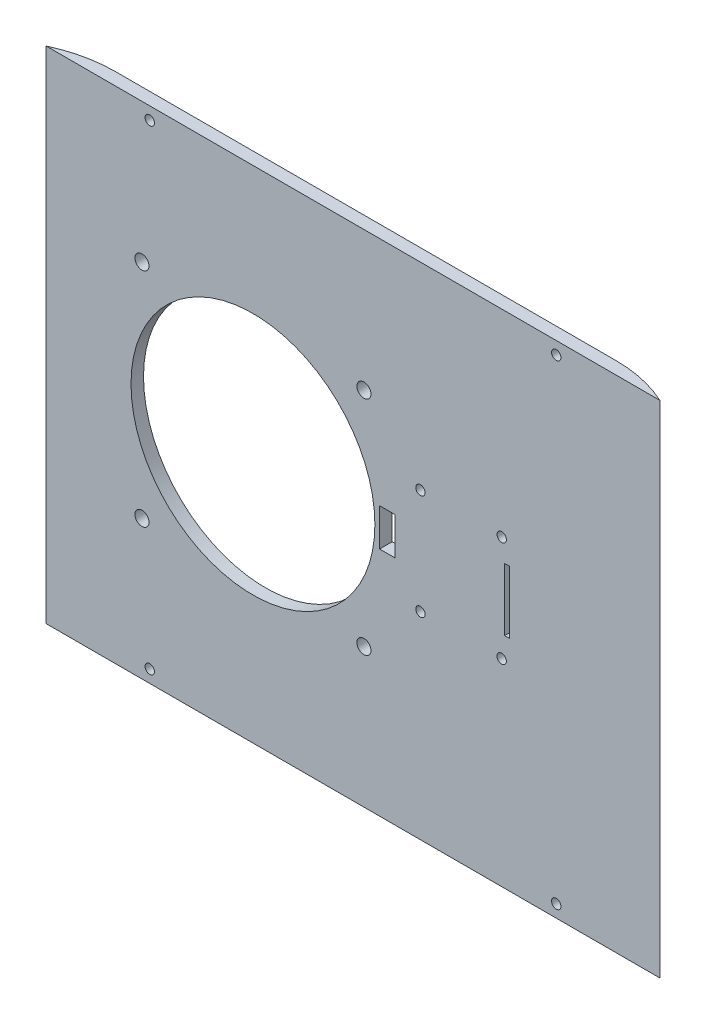
ISO-10303-21;
HEADER;
FILE_DESCRIPTION(('STEP AP214'),'2;1');
FILE_NAME('part.step','',(''),(''),'','','');
FILE_SCHEMA(('AUTOMOTIVE_DESIGN { 1 0 10303 214 1 1 1 1 }'));
ENDSEC;
DATA;
#1=APPLICATION_CONTEXT('core data for automotive mechanical design processes');
#2=APPLICATION_PROTOCOL_DEFINITION('international standard','automotive_design',2000,#1);
#3=PRODUCT_CONTEXT('',#1,'mechanical');
#4=PRODUCT('Part','Part','',(#3));
#5=PRODUCT_RELATED_PRODUCT_CATEGORY('part','',(#4));
#6=PRODUCT_DEFINITION_FORMATION('','',#4);
#7=PRODUCT_DEFINITION_CONTEXT('part definition',#1,'design');
#8=PRODUCT_DEFINITION('design','',#6,#7);
#9=PRODUCT_DEFINITION_SHAPE('','',#8);
#10=(LENGTH_UNIT() NAMED_UNIT(*) SI_UNIT(.MILLI.,.METRE.));
#11=(NAMED_UNIT(*) PLANE_ANGLE_UNIT() SI_UNIT($,.RADIAN.));
#12=(NAMED_UNIT(*) SI_UNIT($,.STERADIAN.) SOLID_ANGLE_UNIT());
#13=UNCERTAINTY_MEASURE_WITH_UNIT(LENGTH_MEASURE(1.E-05),#10,'distance_accuracy_value','');
#14=(GEOMETRIC_REPRESENTATION_CONTEXT(3) GLOBAL_UNCERTAINTY_ASSIGNED_CONTEXT((#13)) GLOBAL_UNIT_ASSIGNED_CONTEXT((#10,
#11,#12)) REPRESENTATION_CONTEXT('',''));
#15=CARTESIAN_POINT('',(0.,0.,0.));
#16=DIRECTION('',(0.,0.,1.));
#17=DIRECTION('',(1.,0.,0.));
#18=AXIS2_PLACEMENT_3D('',#15,#16,#17);
#19=CARTESIAN_POINT('',(0.,0.,0.));
#20=DIRECTION('',(0.,0.,1.));
#21=DIRECTION('',(1.,0.,0.));
#22=AXIS2_PLACEMENT_3D('',#19,#20,#21);
#23=PLANE('',#22);
#24=CARTESIAN_POINT('',(61.5161251372119,-62.99,0.));
#25=DIRECTION('',(0.,0.,1.));
#26=DIRECTION('',(1.,0.,0.));
#27=AXIS2_PLACEMENT_3D('',#24,#25,#26);
#28=CIRCLE('',#27,1.49999999999999);
#29=CARTESIAN_POINT('',(63.0161251372118,-62.99,0.));
#30=VERTEX_POINT('',#29);
#31=EDGE_CURVE('E317',#30,#30,#28,.T.);
#32=ORIENTED_EDGE('',*,*,#31,.T.);
#33=EDGE_LOOP('',(#32));
#34=FACE_BOUND('',#33,.T.);
#35=CARTESIAN_POINT('',(-68.4838748627881,-62.99,0.));
#36=DIRECTION('',(0.,0.,1.));
#37=DIRECTION('',(1.,0.,0.));
#38=AXIS2_PLACEMENT_3D('',#35,#36,#37);
#39=CIRCLE('',#38,1.5);
#40=CARTESIAN_POINT('',(-66.9838748627881,-62.99,0.));
#41=VERTEX_POINT('',#40);
#42=EDGE_CURVE('E322',#41,#41,#39,.T.);
#43=ORIENTED_EDGE('',*,*,#42,.T.);
#44=EDGE_LOOP('',(#43));
#45=FACE_BOUND('',#44,.T.);
#46=CARTESIAN_POINT('',(61.5161251372119,89.01,0.));
#47=DIRECTION('',(0.,0.,1.));
#48=DIRECTION('',(1.,0.,0.));
#49=AXIS2_PLACEMENT_3D('',#46,#47,#48);
#50=CIRCLE('',#49,1.49999999999999);
#51=CARTESIAN_POINT('',(63.0161251372118,89.01,0.));
#52=VERTEX_POINT('',#51);
#53=EDGE_CURVE('E330',#52,#52,#50,.T.);
#54=ORIENTED_EDGE('',*,*,#53,.T.);
#55=EDGE_LOOP('',(#54));
#56=FACE_BOUND('',#55,.T.);
#57=CARTESIAN_POINT('',(-68.4838748627882,89.01,0.));
#58=DIRECTION('',(0.,0.,1.));
#59=DIRECTION('',(1.,0.,0.));
#60=AXIS2_PLACEMENT_3D('',#57,#58,#59);
#61=CIRCLE('',#60,1.5);
#62=CARTESIAN_POINT('',(-66.9838748627882,89.01,0.));
#63=VERTEX_POINT('',#62);
#64=EDGE_CURVE('E338',#63,#63,#61,.T.);
#65=ORIENTED_EDGE('',*,*,#64,.T.);
#66=EDGE_LOOP('',(#65));
#67=FACE_BOUND('',#66,.T.);
#68=CARTESIAN_POINT('',(44.0719050477542,29.8436474999944,0.));
#69=DIRECTION('',(0.,0.,-1.));
#70=DIRECTION('',(-1.,0.,0.));
#71=AXIS2_PLACEMENT_3D('',#68,#69,#70);
#72=CIRCLE('',#71,1.5);
#73=CARTESIAN_POINT('',(42.5719050477542,29.8436474999944,0.));
#74=VERTEX_POINT('',#73);
#75=EDGE_CURVE('E249',#74,#74,#72,.T.);
#76=ORIENTED_EDGE('',*,*,#75,.F.);
#77=EDGE_LOOP('',(#76));
#78=FACE_BOUND('',#77,.T.);
#79=CARTESIAN_POINT('',(44.0719050477542,-3.82364749999439,0.));
#80=DIRECTION('',(0.,0.,-1.));
#81=DIRECTION('',(-1.,0.,0.));
#82=AXIS2_PLACEMENT_3D('',#79,#80,#81);
#83=CIRCLE('',#82,1.5);
#84=CARTESIAN_POINT('',(42.5719050477542,-3.82364749999439,0.));
#85=VERTEX_POINT('',#84);
#86=EDGE_CURVE('E245',#85,#85,#83,.T.);
#87=ORIENTED_EDGE('',*,*,#86,.F.);
#88=EDGE_LOOP('',(#87));
#89=FACE_BOUND('',#88,.T.);
#90=CARTESIAN_POINT('',(18.0829228366695,-3.82364749999439,0.));
#91=DIRECTION('',(0.,0.,-1.));
#92=DIRECTION('',(-1.,0.,0.));
#93=AXIS2_PLACEMENT_3D('',#90,#91,#92);
#94=CIRCLE('',#93,1.5);
#95=CARTESIAN_POINT('',(16.5829228366695,-3.82364749999439,0.));
#96=VERTEX_POINT('',#95);
#97=EDGE_CURVE('E250',#96,#96,#94,.T.);
#98=ORIENTED_EDGE('',*,*,#97,.F.);
#99=EDGE_LOOP('',(#98));
#100=FACE_BOUND('',#99,.T.);
#101=CARTESIAN_POINT('',(18.0829228366695,29.8436474999944,0.));
#102=DIRECTION('',(0.,0.,-1.));
#103=DIRECTION('',(-1.,0.,0.));
#104=AXIS2_PLACEMENT_3D('',#101,#102,#103);
#105=CIRCLE('',#104,1.5);
#106=CARTESIAN_POINT('',(16.5829228366695,29.8436474999944,0.));
#107=VERTEX_POINT('',#106);
#108=EDGE_CURVE('E254',#107,#107,#105,.T.);
#109=ORIENTED_EDGE('',*,*,#108,.F.);
#110=EDGE_LOOP('',(#109));
#111=FACE_BOUND('',#110,.T.);
#112=DIRECTION('',(-1.,0.,0.));
#113=VECTOR('',#112,1.);
#114=CARTESIAN_POINT('',(45.0161251372118,3.01000000000001,0.));
#115=LINE('',#114,#113);
#116=CARTESIAN_POINT('',(46.5161251372118,3.01000000000001,0.));
#117=VERTEX_POINT('',#116);
#118=CARTESIAN_POINT('',(45.0161251372118,3.01000000000001,0.));
#119=VERTEX_POINT('',#118);
#120=EDGE_CURVE('E261',#117,#119,#115,.T.);
#121=ORIENTED_EDGE('',*,*,#120,.F.);
#122=DIRECTION('',(0.,-1.,0.));
#123=VECTOR('',#122,1.);
#124=CARTESIAN_POINT('',(46.5161251372118,3.01000000000001,0.));
#125=LINE('',#124,#123);
#126=CARTESIAN_POINT('',(46.5161251372118,23.01,0.));
#127=VERTEX_POINT('',#126);
#128=EDGE_CURVE('E244',#127,#117,#125,.T.);
#129=ORIENTED_EDGE('',*,*,#128,.F.);
#130=DIRECTION('',(1.,0.,0.));
#131=VECTOR('',#130,1.);
#132=CARTESIAN_POINT('',(46.5161251372118,23.01,0.));
#133=LINE('',#132,#131);
#134=CARTESIAN_POINT('',(45.0161251372118,23.01,0.));
#135=VERTEX_POINT('',#134);
#136=EDGE_CURVE('E269',#135,#127,#133,.T.);
#137=ORIENTED_EDGE('',*,*,#136,.F.);
#138=DIRECTION('',(0.,1.,0.));
#139=VECTOR('',#138,1.);
#140=CARTESIAN_POINT('',(45.0161251372118,23.01,0.));
#141=LINE('',#140,#139);
#142=EDGE_CURVE('E265',#119,#135,#141,.T.);
#143=ORIENTED_EDGE('',*,*,#142,.F.);
#144=EDGE_LOOP('',(#121,#129,#137,#143));
#145=FACE_BOUND('',#144,.T.);
#146=CARTESIAN_POINT('',(-35.4838748627881,13.01,0.));
#147=DIRECTION('',(0.,0.,-1.));
#148=DIRECTION('',(-1.,0.,0.));
#149=AXIS2_PLACEMENT_3D('',#146,#147,#148);
#150=CIRCLE('',#149,39.);
#151=CARTESIAN_POINT('',(-74.4838748627882,13.01,0.));
#152=VERTEX_POINT('',#151);
#153=EDGE_CURVE('E172',#152,#152,#150,.T.);
#154=ORIENTED_EDGE('',*,*,#153,.F.);
#155=EDGE_LOOP('',(#154));
#156=FACE_BOUND('',#155,.T.);
#157=CARTESIAN_POINT('',(-70.9838748597865,48.5099999969985,0.));
#158=DIRECTION('',(0.,0.,-1.));
#159=DIRECTION('',(-1.,0.,0.));
#160=AXIS2_PLACEMENT_3D('',#157,#158,#159);
#161=CIRCLE('',#160,2.24999999999997);
#162=CARTESIAN_POINT('',(-73.2338748597865,48.5099999969985,0.));
#163=VERTEX_POINT('',#162);
#164=EDGE_CURVE('E168',#163,#163,#161,.T.);
#165=ORIENTED_EDGE('',*,*,#164,.F.);
#166=EDGE_LOOP('',(#165));
#167=FACE_BOUND('',#166,.T.);
#168=CARTESIAN_POINT('',(-70.9838748597865,-22.4899999969985,0.));
#169=DIRECTION('',(0.,0.,-1.));
#170=DIRECTION('',(1.,0.,0.));
#171=AXIS2_PLACEMENT_3D('',#168,#169,#170);
#172=CIRCLE('',#171,2.25000000000001);
#173=CARTESIAN_POINT('',(-68.7338748597865,-22.4899999969985,0.));
#174=VERTEX_POINT('',#173);
#175=EDGE_CURVE('E173',#174,#174,#172,.T.);
#176=ORIENTED_EDGE('',*,*,#175,.F.);
#177=EDGE_LOOP('',(#176));
#178=FACE_BOUND('',#177,.T.);
#179=CARTESIAN_POINT('',(0.0161251342101765,48.5099999969985,0.));
#180=DIRECTION('',(0.,0.,-1.));
#181=DIRECTION('',(1.,0.,0.));
#182=AXIS2_PLACEMENT_3D('',#179,#180,#181);
#183=CIRCLE('',#182,2.25);
#184=CARTESIAN_POINT('',(2.26612513421017,48.5099999969985,0.));
#185=VERTEX_POINT('',#184);
#186=EDGE_CURVE('E177',#185,#185,#183,.T.);
#187=ORIENTED_EDGE('',*,*,#186,.F.);
#188=EDGE_LOOP('',(#187));
#189=FACE_BOUND('',#188,.T.);
#190=CARTESIAN_POINT('',(0.0161251342101765,-22.4899999969985,0.));
#191=DIRECTION('',(0.,0.,-1.));
#192=DIRECTION('',(-1.,0.,0.));
#193=AXIS2_PLACEMENT_3D('',#190,#191,#192);
#194=CIRCLE('',#193,2.25000000000001);
#195=CARTESIAN_POINT('',(-2.23387486578983,-22.4899999969985,0.));
#196=VERTEX_POINT('',#195);
#197=EDGE_CURVE('E181',#196,#196,#194,.T.);
#198=ORIENTED_EDGE('',*,*,#197,.F.);
#199=EDGE_LOOP('',(#198));
#200=FACE_BOUND('',#199,.T.);
#201=DIRECTION('',(-1.,0.,0.));
#202=VECTOR('',#201,1.);
#203=CARTESIAN_POINT('',(5.01612513721185,7.01,0.));
#204=LINE('',#203,#202);
#205=CARTESIAN_POINT('',(10.0161251372119,7.01,0.));
#206=VERTEX_POINT('',#205);
#207=CARTESIAN_POINT('',(5.01612513721185,7.01,0.));
#208=VERTEX_POINT('',#207);
#209=EDGE_CURVE('E188',#206,#208,#204,.T.);
#210=ORIENTED_EDGE('',*,*,#209,.F.);
#211=DIRECTION('',(0.,-1.,0.));
#212=VECTOR('',#211,1.);
#213=CARTESIAN_POINT('',(10.0161251372119,7.01,0.));
#214=LINE('',#213,#212);
#215=CARTESIAN_POINT('',(10.0161251372119,19.01,0.));
#216=VERTEX_POINT('',#215);
#217=EDGE_CURVE('E67',#216,#206,#214,.T.);
#218=ORIENTED_EDGE('',*,*,#217,.F.);
#219=DIRECTION('',(1.,0.,0.));
#220=VECTOR('',#219,1.);
#221=CARTESIAN_POINT('',(5.01612513721185,19.01,0.));
#222=LINE('',#221,#220);
#223=CARTESIAN_POINT('',(5.01612513721185,19.01,0.));
#224=VERTEX_POINT('',#223);
#225=EDGE_CURVE('E195',#224,#216,#222,.T.);
#226=ORIENTED_EDGE('',*,*,#225,.F.);
#227=DIRECTION('',(0.,1.,0.));
#228=VECTOR('',#227,1.);
#229=CARTESIAN_POINT('',(5.01612513721185,7.01,0.));
#230=LINE('',#229,#228);
#231=EDGE_CURVE('E191',#208,#224,#230,.T.);
#232=ORIENTED_EDGE('',*,*,#231,.F.);
#233=EDGE_LOOP('',(#210,#218,#226,#232));
#234=FACE_BOUND('',#233,.T.);
#235=DIRECTION('',(0.,1.,0.));
#236=VECTOR('',#235,1.);
#237=CARTESIAN_POINT('',(-83.4838748627882,-136.12835714,0.));
#238=LINE('',#237,#236);
#239=CARTESIAN_POINT('',(-83.4838748627882,-66.99,0.));
#240=VERTEX_POINT('',#239);
#241=CARTESIAN_POINT('',(-83.4838748627882,93.01,0.));
#242=VERTEX_POINT('',#241);
#243=EDGE_CURVE('E154',#240,#242,#238,.T.);
#244=ORIENTED_EDGE('',*,*,#243,.T.);
#245=DIRECTION('',(-1.,0.,0.));
#246=VECTOR('',#245,1.);
#247=CARTESIAN_POINT('',(-83.4838748627882,93.01,0.));
#248=LINE('',#247,#246);
#249=CARTESIAN_POINT('',(76.5161251372118,93.01,0.));
#250=VERTEX_POINT('',#249);
#251=EDGE_CURVE('E45',#250,#242,#248,.T.);
#252=ORIENTED_EDGE('',*,*,#251,.F.);
#253=DIRECTION('',(0.,1.,0.));
#254=VECTOR('',#253,1.);
#255=CARTESIAN_POINT('',(76.5161251372118,-136.12835714,0.));
#256=LINE('',#255,#254);
#257=CARTESIAN_POINT('',(76.5161251372118,-66.99,0.));
#258=VERTEX_POINT('',#257);
#259=EDGE_CURVE('E155',#258,#250,#256,.T.);
#260=ORIENTED_EDGE('',*,*,#259,.F.);
#261=DIRECTION('',(1.,0.,0.));
#262=VECTOR('',#261,1.);
#263=CARTESIAN_POINT('',(-83.4838748627881,-66.99,0.));
#264=LINE('',#263,#262);
#265=EDGE_CURVE('E346',#240,#258,#264,.T.);
#266=ORIENTED_EDGE('',*,*,#265,.F.);
#267=EDGE_LOOP('',(#244,#252,#260,#266));
#268=FACE_BOUND('',#267,.T.);
#269=ADVANCED_FACE('F41',(#34,#45,#56,#67,#78,#89,#100,#111,#145,#156,#167,#178,#189,#200,#234,
#268),#23,.F.);
#270=CARTESIAN_POINT('',(0.,0.,4.));
#271=DIRECTION('',(0.,0.,1.));
#272=DIRECTION('',(1.,0.,0.));
#273=AXIS2_PLACEMENT_3D('',#270,#271,#272);
#274=PLANE('',#273);
#275=DIRECTION('',(0.,1.,0.));
#276=VECTOR('',#275,1.);
#277=CARTESIAN_POINT('',(10.0161251372119,0.,4.));
#278=LINE('',#277,#276);
#279=CARTESIAN_POINT('',(10.0161251372119,7.01,4.));
#280=VERTEX_POINT('',#279);
#281=CARTESIAN_POINT('',(10.0161251372119,19.01,4.));
#282=VERTEX_POINT('',#281);
#283=EDGE_CURVE('E241',#280,#282,#278,.T.);
#284=ORIENTED_EDGE('',*,*,#283,.F.);
#285=DIRECTION('',(1.,0.,0.));
#286=VECTOR('',#285,1.);
#287=CARTESIAN_POINT('',(0.,7.01,4.));
#288=LINE('',#287,#286);
#289=CARTESIAN_POINT('',(5.01612513721185,7.01,4.));
#290=VERTEX_POINT('',#289);
#291=EDGE_CURVE('E232',#290,#280,#288,.T.);
#292=ORIENTED_EDGE('',*,*,#291,.F.);
#293=DIRECTION('',(0.,-1.,0.));
#294=VECTOR('',#293,1.);
#295=CARTESIAN_POINT('',(5.01612513721185,0.,4.));
#296=LINE('',#295,#294);
#297=CARTESIAN_POINT('',(5.01612513721185,19.01,4.));
#298=VERTEX_POINT('',#297);
#299=EDGE_CURVE('E235',#298,#290,#296,.T.);
#300=ORIENTED_EDGE('',*,*,#299,.F.);
#301=DIRECTION('',(-1.,0.,0.));
#302=VECTOR('',#301,1.);
#303=CARTESIAN_POINT('',(0.,19.01,4.));
#304=LINE('',#303,#302);
#305=EDGE_CURVE('E238',#282,#298,#304,.T.);
#306=ORIENTED_EDGE('',*,*,#305,.F.);
#307=EDGE_LOOP('',(#284,#292,#300,#306));
#308=FACE_BOUND('',#307,.T.);
#309=CARTESIAN_POINT('',(0.0161251342101765,-22.4899999969985,4.));
#310=DIRECTION('',(0.,0.,1.));
#311=DIRECTION('',(1.,0.,0.));
#312=AXIS2_PLACEMENT_3D('',#309,#310,#311);
#313=CIRCLE('',#312,2.25000000000001);
#314=CARTESIAN_POINT('',(2.26612513421019,-22.4899999969985,4.));
#315=VERTEX_POINT('',#314);
#316=EDGE_CURVE('E228',#315,#315,#313,.T.);
#317=ORIENTED_EDGE('',*,*,#316,.F.);
#318=EDGE_LOOP('',(#317));
#319=FACE_BOUND('',#318,.T.);
#320=CARTESIAN_POINT('',(0.0161251342101765,48.5099999969985,4.));
#321=DIRECTION('',(0.,0.,1.));
#322=DIRECTION('',(1.,0.,0.));
#323=AXIS2_PLACEMENT_3D('',#320,#321,#322);
#324=CIRCLE('',#323,2.25);
#325=CARTESIAN_POINT('',(2.26612513421017,48.5099999969985,4.));
#326=VERTEX_POINT('',#325);
#327=EDGE_CURVE('E224',#326,#326,#324,.T.);
#328=ORIENTED_EDGE('',*,*,#327,.F.);
#329=EDGE_LOOP('',(#328));
#330=FACE_BOUND('',#329,.T.);
#331=CARTESIAN_POINT('',(-70.9838748597865,-22.4899999969985,4.));
#332=DIRECTION('',(0.,0.,1.));
#333=DIRECTION('',(1.,0.,0.));
#334=AXIS2_PLACEMENT_3D('',#331,#332,#333);
#335=CIRCLE('',#334,2.25000000000001);
#336=CARTESIAN_POINT('',(-68.7338748597865,-22.4899999969985,4.));
#337=VERTEX_POINT('',#336);
#338=EDGE_CURVE('E220',#337,#337,#335,.T.);
#339=ORIENTED_EDGE('',*,*,#338,.F.);
#340=EDGE_LOOP('',(#339));
#341=FACE_BOUND('',#340,.T.);
#342=CARTESIAN_POINT('',(-70.9838748597865,48.5099999969985,4.));
#343=DIRECTION('',(0.,0.,1.));
#344=DIRECTION('',(1.,0.,0.));
#345=AXIS2_PLACEMENT_3D('',#342,#343,#344);
#346=CIRCLE('',#345,2.24999999999997);
#347=CARTESIAN_POINT('',(-68.7338748597865,48.5099999969985,4.));
#348=VERTEX_POINT('',#347);
#349=EDGE_CURVE('E216',#348,#348,#346,.T.);
#350=ORIENTED_EDGE('',*,*,#349,.F.);
#351=EDGE_LOOP('',(#350));
#352=FACE_BOUND('',#351,.T.);
#353=CARTESIAN_POINT('',(-35.4838748627881,13.01,4.));
#354=DIRECTION('',(0.,0.,1.));
#355=DIRECTION('',(1.,0.,0.));
#356=AXIS2_PLACEMENT_3D('',#353,#354,#355);
#357=CIRCLE('',#356,39.);
#358=CARTESIAN_POINT('',(3.51612513721186,13.01,4.));
#359=VERTEX_POINT('',#358);
#360=EDGE_CURVE('E212',#359,#359,#357,.T.);
#361=ORIENTED_EDGE('',*,*,#360,.F.);
#362=EDGE_LOOP('',(#361));
#363=FACE_BOUND('',#362,.T.);
#364=DIRECTION('',(0.,1.,0.));
#365=VECTOR('',#364,1.);
#366=CARTESIAN_POINT('',(46.5161251372118,0.,4.));
#367=LINE('',#366,#365);
#368=CARTESIAN_POINT('',(46.5161251372118,3.01000000000001,4.));
#369=VERTEX_POINT('',#368);
#370=CARTESIAN_POINT('',(46.5161251372118,23.01,4.));
#371=VERTEX_POINT('',#370);
#372=EDGE_CURVE('E314',#369,#371,#367,.T.);
#373=ORIENTED_EDGE('',*,*,#372,.F.);
#374=DIRECTION('',(1.,0.,0.));
#375=VECTOR('',#374,1.);
#376=CARTESIAN_POINT('',(0.,3.00999999999996,4.));
#377=LINE('',#376,#375);
#378=CARTESIAN_POINT('',(45.0161251372118,3.01000000000001,4.));
#379=VERTEX_POINT('',#378);
#380=EDGE_CURVE('E304',#379,#369,#377,.T.);
#381=ORIENTED_EDGE('',*,*,#380,.F.);
#382=DIRECTION('',(0.,-1.,0.));
#383=VECTOR('',#382,1.);
#384=CARTESIAN_POINT('',(45.0161251372118,0.,4.));
#385=LINE('',#384,#383);
#386=CARTESIAN_POINT('',(45.0161251372118,23.01,4.));
#387=VERTEX_POINT('',#386);
#388=EDGE_CURVE('E307',#387,#379,#385,.T.);
#389=ORIENTED_EDGE('',*,*,#388,.F.);
#390=DIRECTION('',(-1.,0.,0.));
#391=VECTOR('',#390,1.);
#392=CARTESIAN_POINT('',(0.,23.01,4.));
#393=LINE('',#392,#391);
#394=EDGE_CURVE('E311',#371,#387,#393,.T.);
#395=ORIENTED_EDGE('',*,*,#394,.F.);
#396=EDGE_LOOP('',(#373,#381,#389,#395));
#397=FACE_BOUND('',#396,.T.);
#398=CARTESIAN_POINT('',(18.0829228366695,29.8436474999944,4.));
#399=DIRECTION('',(0.,0.,1.));
#400=DIRECTION('',(1.,0.,0.));
#401=AXIS2_PLACEMENT_3D('',#398,#399,#400);
#402=CIRCLE('',#401,1.5);
#403=CARTESIAN_POINT('',(19.5829228366695,29.8436474999944,4.));
#404=VERTEX_POINT('',#403);
#405=EDGE_CURVE('E300',#404,#404,#402,.T.);
#406=ORIENTED_EDGE('',*,*,#405,.F.);
#407=EDGE_LOOP('',(#406));
#408=FACE_BOUND('',#407,.T.);
#409=CARTESIAN_POINT('',(18.0829228366695,-3.82364749999439,4.));
#410=DIRECTION('',(0.,0.,1.));
#411=DIRECTION('',(1.,0.,0.));
#412=AXIS2_PLACEMENT_3D('',#409,#410,#411);
#413=CIRCLE('',#412,1.5);
#414=CARTESIAN_POINT('',(19.5829228366695,-3.82364749999439,4.));
#415=VERTEX_POINT('',#414);
#416=EDGE_CURVE('E296',#415,#415,#413,.T.);
#417=ORIENTED_EDGE('',*,*,#416,.F.);
#418=EDGE_LOOP('',(#417));
#419=FACE_BOUND('',#418,.T.);
#420=CARTESIAN_POINT('',(44.0719050477542,-3.82364749999439,4.));
#421=DIRECTION('',(0.,0.,1.));
#422=DIRECTION('',(1.,0.,0.));
#423=AXIS2_PLACEMENT_3D('',#420,#421,#422);
#424=CIRCLE('',#423,1.5);
#425=CARTESIAN_POINT('',(45.5719050477542,-3.82364749999439,4.));
#426=VERTEX_POINT('',#425);
#427=EDGE_CURVE('E292',#426,#426,#424,.T.);
#428=ORIENTED_EDGE('',*,*,#427,.F.);
#429=EDGE_LOOP('',(#428));
#430=FACE_BOUND('',#429,.T.);
#431=CARTESIAN_POINT('',(44.0719050477542,29.8436474999944,4.));
#432=DIRECTION('',(0.,0.,1.));
#433=DIRECTION('',(1.,0.,0.));
#434=AXIS2_PLACEMENT_3D('',#431,#432,#433);
#435=CIRCLE('',#434,1.5);
#436=CARTESIAN_POINT('',(45.5719050477542,29.8436474999944,4.));
#437=VERTEX_POINT('',#436);
#438=EDGE_CURVE('E288',#437,#437,#435,.T.);
#439=ORIENTED_EDGE('',*,*,#438,.F.);
#440=EDGE_LOOP('',(#439));
#441=FACE_BOUND('',#440,.T.);
#442=CARTESIAN_POINT('',(-68.4838748627881,-62.99,4.));
#443=DIRECTION('',(0.,0.,1.));
#444=DIRECTION('',(1.,0.,0.));
#445=AXIS2_PLACEMENT_3D('',#442,#443,#444);
#446=CIRCLE('',#445,1.5);
#447=CARTESIAN_POINT('',(-66.9838748627881,-62.99,4.));
#448=VERTEX_POINT('',#447);
#449=EDGE_CURVE('E326',#448,#448,#446,.T.);
#450=ORIENTED_EDGE('',*,*,#449,.F.);
#451=EDGE_LOOP('',(#450));
#452=FACE_BOUND('',#451,.T.);
#453=CARTESIAN_POINT('',(-68.4838748627882,89.01,4.));
#454=DIRECTION('',(0.,0.,1.));
#455=DIRECTION('',(1.,0.,0.));
#456=AXIS2_PLACEMENT_3D('',#453,#454,#455);
#457=CIRCLE('',#456,1.5);
#458=CARTESIAN_POINT('',(-66.9838748627882,89.01,4.));
#459=VERTEX_POINT('',#458);
#460=EDGE_CURVE('E342',#459,#459,#457,.T.);
#461=ORIENTED_EDGE('',*,*,#460,.F.);
#462=EDGE_LOOP('',(#461));
#463=FACE_BOUND('',#462,.T.);
#464=DIRECTION('',(-1.,0.,0.));
#465=VECTOR('',#464,1.);
#466=CARTESIAN_POINT('',(-83.4838748627882,93.01,4.));
#467=LINE('',#466,#465);
#468=CARTESIAN_POINT('',(94.6544822772119,93.01,4.));
#469=VERTEX_POINT('',#468);
#470=CARTESIAN_POINT('',(-101.622232002788,93.01,4.));
#471=VERTEX_POINT('',#470);
#472=EDGE_CURVE('E11',#469,#471,#467,.T.);
#473=ORIENTED_EDGE('',*,*,#472,.T.);
#474=DIRECTION('',(0.,1.,0.));
#475=VECTOR('',#474,1.);
#476=CARTESIAN_POINT('',(-101.622232002788,-66.99,4.));
#477=LINE('',#476,#475);
#478=CARTESIAN_POINT('',(-101.622232002788,-66.99,4.));
#479=VERTEX_POINT('',#478);
#480=EDGE_CURVE('E133',#479,#471,#477,.T.);
#481=ORIENTED_EDGE('',*,*,#480,.F.);
#482=DIRECTION('',(1.,0.,0.));
#483=VECTOR('',#482,1.);
#484=CARTESIAN_POINT('',(-83.4838748627881,-66.99,4.));
#485=LINE('',#484,#483);
#486=CARTESIAN_POINT('',(94.6544822772119,-66.99,4.));
#487=VERTEX_POINT('',#486);
#488=EDGE_CURVE('E51',#479,#487,#485,.T.);
#489=ORIENTED_EDGE('',*,*,#488,.T.);
#490=DIRECTION('',(0.,-1.,0.));
#491=VECTOR('',#490,1.);
#492=CARTESIAN_POINT('',(94.6544822772119,93.01,4.));
#493=LINE('',#492,#491);
#494=EDGE_CURVE('E144',#469,#487,#493,.T.);
#495=ORIENTED_EDGE('',*,*,#494,.F.);
#496=EDGE_LOOP('',(#473,#481,#489,#495));
#497=FACE_BOUND('',#496,.T.);
#498=CARTESIAN_POINT('',(61.5161251372119,89.01,4.));
#499=DIRECTION('',(0.,0.,1.));
#500=DIRECTION('',(1.,0.,0.));
#501=AXIS2_PLACEMENT_3D('',#498,#499,#500);
#502=CIRCLE('',#501,1.49999999999999);
#503=CARTESIAN_POINT('',(63.0161251372118,89.01,4.));
#504=VERTEX_POINT('',#503);
#505=EDGE_CURVE('E334',#504,#504,#502,.T.);
#506=ORIENTED_EDGE('',*,*,#505,.F.);
#507=EDGE_LOOP('',(#506));
#508=FACE_BOUND('',#507,.T.);
#509=CARTESIAN_POINT('',(61.5161251372119,-62.99,4.));
#510=DIRECTION('',(0.,0.,1.));
#511=DIRECTION('',(1.,0.,0.));
#512=AXIS2_PLACEMENT_3D('',#509,#510,#511);
#513=CIRCLE('',#512,1.49999999999999);
#514=CARTESIAN_POINT('',(63.0161251372118,-62.99,4.));
#515=VERTEX_POINT('',#514);
#516=EDGE_CURVE('E318',#515,#515,#513,.T.);
#517=ORIENTED_EDGE('',*,*,#516,.F.);
#518=EDGE_LOOP('',(#517));
#519=FACE_BOUND('',#518,.T.);
#520=ADVANCED_FACE('F157',(#308,#319,#330,#341,#352,#363,#397,#408,#419,#430,#441,#452,#463,
#497,#508,#519),#274,.T.);
#521=CARTESIAN_POINT('',(-83.4838748627881,-66.99,4.));
#522=DIRECTION('',(0.,1.,0.));
#523=DIRECTION('',(0.,0.,1.));
#524=AXIS2_PLACEMENT_3D('',#521,#522,#523);
#525=PLANE('',#524);
#526=ORIENTED_EDGE('',*,*,#488,.F.);
#527=CARTESIAN_POINT('',(-83.4838748627882,-66.99,43.1249999672737));
#528=DIRECTION('',(0.,1.,0.));
#529=DIRECTION('',(0.,0.,1.));
#530=AXIS2_PLACEMENT_3D('',#527,#528,#529);
#531=CIRCLE('',#530,43.1249999672737);
#532=EDGE_CURVE('E139',#479,#240,#531,.F.);
#533=ORIENTED_EDGE('',*,*,#532,.T.);
#534=ORIENTED_EDGE('',*,*,#265,.T.);
#535=CARTESIAN_POINT('',(76.5161251372118,-66.99,43.1249999672737));
#536=DIRECTION('',(0.,1.,0.));
#537=DIRECTION('',(0.,0.,1.));
#538=AXIS2_PLACEMENT_3D('',#535,#536,#537);
#539=CIRCLE('',#538,43.1249999672737);
#540=EDGE_CURVE('E164',#258,#487,#539,.F.);
#541=ORIENTED_EDGE('',*,*,#540,.T.);
#542=EDGE_LOOP('',(#526,#533,#534,#541));
#543=FACE_BOUND('',#542,.T.);
#544=ADVANCED_FACE('F43',(#543),#525,.F.);
#545=CARTESIAN_POINT('',(-83.4838748627882,93.01,4.));
#546=DIRECTION('',(0.,-1.,0.));
#547=DIRECTION('',(0.,0.,-1.));
#548=AXIS2_PLACEMENT_3D('',#545,#546,#547);
#549=PLANE('',#548);
#550=ORIENTED_EDGE('',*,*,#251,.T.);
#551=CARTESIAN_POINT('',(-83.4838748627882,93.01,43.1249999672737));
#552=DIRECTION('',(0.,-1.,0.));
#553=DIRECTION('',(0.,0.,1.));
#554=AXIS2_PLACEMENT_3D('',#551,#552,#553);
#555=CIRCLE('',#554,43.1249999672737);
#556=EDGE_CURVE('E136',#471,#242,#555,.T.);
#557=ORIENTED_EDGE('',*,*,#556,.F.);
#558=ORIENTED_EDGE('',*,*,#472,.F.);
#559=CARTESIAN_POINT('',(76.5161251372118,93.01,43.1249999672737));
#560=DIRECTION('',(0.,-1.,0.));
#561=DIRECTION('',(0.,0.,-1.));
#562=AXIS2_PLACEMENT_3D('',#559,#560,#561);
#563=CIRCLE('',#562,43.1249999672737);
#564=EDGE_CURVE('E359',#250,#469,#563,.T.);
#565=ORIENTED_EDGE('',*,*,#564,.F.);
#566=EDGE_LOOP('',(#550,#557,#558,#565));
#567=FACE_BOUND('',#566,.T.);
#568=ADVANCED_FACE('F149',(#567),#549,.F.);
#569=CARTESIAN_POINT('',(-68.4838748627882,89.01,4.));
#570=DIRECTION('',(0.,0.,-1.));
#571=DIRECTION('',(-1.,0.,0.));
#572=AXIS2_PLACEMENT_3D('',#569,#570,#571);
#573=CYLINDRICAL_SURFACE('',#572,1.5);
#574=ORIENTED_EDGE('',*,*,#460,.T.);
#575=EDGE_LOOP('',(#574));
#576=FACE_BOUND('',#575,.T.);
#577=ORIENTED_EDGE('',*,*,#64,.F.);
#578=EDGE_LOOP('',(#577));
#579=FACE_BOUND('',#578,.T.);
#580=ADVANCED_FACE('F389',(#576,#579),#573,.F.);
#581=CARTESIAN_POINT('',(61.5161251372119,89.01,4.));
#582=DIRECTION('',(0.,0.,-1.));
#583=DIRECTION('',(-1.,0.,0.));
#584=AXIS2_PLACEMENT_3D('',#581,#582,#583);
#585=CYLINDRICAL_SURFACE('',#584,1.49999999999999);
#586=ORIENTED_EDGE('',*,*,#505,.T.);
#587=EDGE_LOOP('',(#586));
#588=FACE_BOUND('',#587,.T.);
#589=ORIENTED_EDGE('',*,*,#53,.F.);
#590=EDGE_LOOP('',(#589));
#591=FACE_BOUND('',#590,.T.);
#592=ADVANCED_FACE('F394',(#588,#591),#585,.F.);
#593=CARTESIAN_POINT('',(-68.4838748627881,-62.99,4.));
#594=DIRECTION('',(0.,0.,-1.));
#595=DIRECTION('',(-1.,0.,0.));
#596=AXIS2_PLACEMENT_3D('',#593,#594,#595);
#597=CYLINDRICAL_SURFACE('',#596,1.5);
#598=ORIENTED_EDGE('',*,*,#449,.T.);
#599=EDGE_LOOP('',(#598));
#600=FACE_BOUND('',#599,.T.);
#601=ORIENTED_EDGE('',*,*,#42,.F.);
#602=EDGE_LOOP('',(#601));
#603=FACE_BOUND('',#602,.T.);
#604=ADVANCED_FACE('F583',(#600,#603),#597,.F.);
#605=CARTESIAN_POINT('',(61.5161251372119,-62.99,4.));
#606=DIRECTION('',(0.,0.,-1.));
#607=DIRECTION('',(-1.,0.,0.));
#608=AXIS2_PLACEMENT_3D('',#605,#606,#607);
#609=CYLINDRICAL_SURFACE('',#608,1.49999999999999);
#610=ORIENTED_EDGE('',*,*,#516,.T.);
#611=EDGE_LOOP('',(#610));
#612=FACE_BOUND('',#611,.T.);
#613=ORIENTED_EDGE('',*,*,#31,.F.);
#614=EDGE_LOOP('',(#613));
#615=FACE_BOUND('',#614,.T.);
#616=ADVANCED_FACE('F573',(#612,#615),#609,.F.);
#617=CARTESIAN_POINT('',(44.0719050477542,29.8436474999944,36.));
#618=DIRECTION('',(0.,0.,-1.));
#619=DIRECTION('',(-1.,0.,0.));
#620=AXIS2_PLACEMENT_3D('',#617,#618,#619);
#621=CYLINDRICAL_SURFACE('',#620,1.5);
#622=ORIENTED_EDGE('',*,*,#438,.T.);
#623=EDGE_LOOP('',(#622));
#624=FACE_BOUND('',#623,.T.);
#625=ORIENTED_EDGE('',*,*,#75,.T.);
#626=EDGE_LOOP('',(#625));
#627=FACE_BOUND('',#626,.T.);
#628=ADVANCED_FACE('F563',(#624,#627),#621,.F.);
#629=CARTESIAN_POINT('',(44.0719050477542,-3.82364749999439,36.));
#630=DIRECTION('',(0.,0.,-1.));
#631=DIRECTION('',(-1.,0.,0.));
#632=AXIS2_PLACEMENT_3D('',#629,#630,#631);
#633=CYLINDRICAL_SURFACE('',#632,1.5);
#634=ORIENTED_EDGE('',*,*,#427,.T.);
#635=EDGE_LOOP('',(#634));
#636=FACE_BOUND('',#635,.T.);
#637=ORIENTED_EDGE('',*,*,#86,.T.);
#638=EDGE_LOOP('',(#637));
#639=FACE_BOUND('',#638,.T.);
#640=ADVANCED_FACE('F553',(#636,#639),#633,.F.);
#641=CARTESIAN_POINT('',(18.0829228366695,-3.82364749999439,36.));
#642=DIRECTION('',(0.,0.,-1.));
#643=DIRECTION('',(-1.,0.,0.));
#644=AXIS2_PLACEMENT_3D('',#641,#642,#643);
#645=CYLINDRICAL_SURFACE('',#644,1.5);
#646=ORIENTED_EDGE('',*,*,#416,.T.);
#647=EDGE_LOOP('',(#646));
#648=FACE_BOUND('',#647,.T.);
#649=ORIENTED_EDGE('',*,*,#97,.T.);
#650=EDGE_LOOP('',(#649));
#651=FACE_BOUND('',#650,.T.);
#652=ADVANCED_FACE('F543',(#648,#651),#645,.F.);
#653=CARTESIAN_POINT('',(18.0829228366695,29.8436474999944,36.));
#654=DIRECTION('',(0.,0.,-1.));
#655=DIRECTION('',(-1.,0.,0.));
#656=AXIS2_PLACEMENT_3D('',#653,#654,#655);
#657=CYLINDRICAL_SURFACE('',#656,1.5);
#658=ORIENTED_EDGE('',*,*,#405,.T.);
#659=EDGE_LOOP('',(#658));
#660=FACE_BOUND('',#659,.T.);
#661=ORIENTED_EDGE('',*,*,#108,.T.);
#662=EDGE_LOOP('',(#661));
#663=FACE_BOUND('',#662,.T.);
#664=ADVANCED_FACE('F533',(#660,#663),#657,.F.);
#665=CARTESIAN_POINT('',(46.5161251372118,3.01000000000001,36.));
#666=DIRECTION('',(1.,0.,0.));
#667=DIRECTION('',(0.,1.,0.));
#668=AXIS2_PLACEMENT_3D('',#665,#666,#667);
#669=PLANE('',#668);
#670=ORIENTED_EDGE('',*,*,#372,.T.);
#671=DIRECTION('',(0.,0.,-1.));
#672=VECTOR('',#671,1.);
#673=CARTESIAN_POINT('',(46.5161251372118,23.01,36.));
#674=LINE('',#673,#672);
#675=EDGE_CURVE('E258',#371,#127,#674,.T.);
#676=ORIENTED_EDGE('',*,*,#675,.T.);
#677=ORIENTED_EDGE('',*,*,#128,.T.);
#678=DIRECTION('',(0.,0.,-1.));
#679=VECTOR('',#678,1.);
#680=CARTESIAN_POINT('',(46.5161251372118,3.01000000000001,36.));
#681=LINE('',#680,#679);
#682=EDGE_CURVE('E273',#369,#117,#681,.T.);
#683=ORIENTED_EDGE('',*,*,#682,.F.);
#684=EDGE_LOOP('',(#670,#676,#677,#683));
#685=FACE_BOUND('',#684,.T.);
#686=ADVANCED_FACE('F523',(#685),#669,.F.);
#687=CARTESIAN_POINT('',(46.5161251372118,23.01,36.));
#688=DIRECTION('',(0.,1.,0.));
#689=DIRECTION('',(0.,0.,1.));
#690=AXIS2_PLACEMENT_3D('',#687,#688,#689);
#691=PLANE('',#690);
#692=ORIENTED_EDGE('',*,*,#394,.T.);
#693=DIRECTION('',(0.,0.,-1.));
#694=VECTOR('',#693,1.);
#695=CARTESIAN_POINT('',(45.0161251372118,23.01,36.));
#696=LINE('',#695,#694);
#697=EDGE_CURVE('E276',#387,#135,#696,.T.);
#698=ORIENTED_EDGE('',*,*,#697,.T.);
#699=ORIENTED_EDGE('',*,*,#136,.T.);
#700=ORIENTED_EDGE('',*,*,#675,.F.);
#701=EDGE_LOOP('',(#692,#698,#699,#700));
#702=FACE_BOUND('',#701,.T.);
#703=ADVANCED_FACE('F513',(#702),#691,.F.);
#704=CARTESIAN_POINT('',(45.0161251372118,23.01,36.));
#705=DIRECTION('',(-1.,0.,0.));
#706=DIRECTION('',(0.,0.,1.));
#707=AXIS2_PLACEMENT_3D('',#704,#705,#706);
#708=PLANE('',#707);
#709=ORIENTED_EDGE('',*,*,#388,.T.);
#710=DIRECTION('',(0.,0.,-1.));
#711=VECTOR('',#710,1.);
#712=CARTESIAN_POINT('',(45.0161251372118,3.01000000000001,36.));
#713=LINE('',#712,#711);
#714=EDGE_CURVE('E279',#379,#119,#713,.T.);
#715=ORIENTED_EDGE('',*,*,#714,.T.);
#716=ORIENTED_EDGE('',*,*,#142,.T.);
#717=ORIENTED_EDGE('',*,*,#697,.F.);
#718=EDGE_LOOP('',(#709,#715,#716,#717));
#719=FACE_BOUND('',#718,.T.);
#720=ADVANCED_FACE('F503',(#719),#708,.F.);
#721=CARTESIAN_POINT('',(45.0161251372118,3.01000000000001,36.));
#722=DIRECTION('',(0.,-1.,0.));
#723=DIRECTION('',(1.,0.,0.));
#724=AXIS2_PLACEMENT_3D('',#721,#722,#723);
#725=PLANE('',#724);
#726=ORIENTED_EDGE('',*,*,#380,.T.);
#727=ORIENTED_EDGE('',*,*,#682,.T.);
#728=ORIENTED_EDGE('',*,*,#120,.T.);
#729=ORIENTED_EDGE('',*,*,#714,.F.);
#730=EDGE_LOOP('',(#726,#727,#728,#729));
#731=FACE_BOUND('',#730,.T.);
#732=ADVANCED_FACE('F493',(#731),#725,.F.);
#733=CARTESIAN_POINT('',(-35.4838748627881,13.01,7.));
#734=DIRECTION('',(0.,0.,-1.));
#735=DIRECTION('',(-1.,0.,0.));
#736=AXIS2_PLACEMENT_3D('',#733,#734,#735);
#737=CYLINDRICAL_SURFACE('',#736,39.);
#738=ORIENTED_EDGE('',*,*,#360,.T.);
#739=EDGE_LOOP('',(#738));
#740=FACE_BOUND('',#739,.T.);
#741=ORIENTED_EDGE('',*,*,#153,.T.);
#742=EDGE_LOOP('',(#741));
#743=FACE_BOUND('',#742,.T.);
#744=ADVANCED_FACE('F484',(#740,#743),#737,.F.);
#745=CARTESIAN_POINT('',(-70.9838748597865,48.5099999969985,7.));
#746=DIRECTION('',(0.,0.,-1.));
#747=DIRECTION('',(-1.,0.,0.));
#748=AXIS2_PLACEMENT_3D('',#745,#746,#747);
#749=CYLINDRICAL_SURFACE('',#748,2.24999999999997);
#750=ORIENTED_EDGE('',*,*,#349,.T.);
#751=EDGE_LOOP('',(#750));
#752=FACE_BOUND('',#751,.T.);
#753=ORIENTED_EDGE('',*,*,#164,.T.);
#754=EDGE_LOOP('',(#753));
#755=FACE_BOUND('',#754,.T.);
#756=ADVANCED_FACE('F474',(#752,#755),#749,.F.);
#757=CARTESIAN_POINT('',(-70.9838748597865,-22.4899999969985,7.));
#758=DIRECTION('',(0.,0.,-1.));
#759=DIRECTION('',(-1.,0.,0.));
#760=AXIS2_PLACEMENT_3D('',#757,#758,#759);
#761=CYLINDRICAL_SURFACE('',#760,2.25000000000001);
#762=ORIENTED_EDGE('',*,*,#338,.T.);
#763=EDGE_LOOP('',(#762));
#764=FACE_BOUND('',#763,.T.);
#765=ORIENTED_EDGE('',*,*,#175,.T.);
#766=EDGE_LOOP('',(#765));
#767=FACE_BOUND('',#766,.T.);
#768=ADVANCED_FACE('F464',(#764,#767),#761,.F.);
#769=CARTESIAN_POINT('',(0.0161251342101765,48.5099999969985,7.));
#770=DIRECTION('',(0.,0.,-1.));
#771=DIRECTION('',(-1.,0.,0.));
#772=AXIS2_PLACEMENT_3D('',#769,#770,#771);
#773=CYLINDRICAL_SURFACE('',#772,2.25);
#774=ORIENTED_EDGE('',*,*,#327,.T.);
#775=EDGE_LOOP('',(#774));
#776=FACE_BOUND('',#775,.T.);
#777=ORIENTED_EDGE('',*,*,#186,.T.);
#778=EDGE_LOOP('',(#777));
#779=FACE_BOUND('',#778,.T.);
#780=ADVANCED_FACE('F454',(#776,#779),#773,.F.);
#781=CARTESIAN_POINT('',(0.0161251342101765,-22.4899999969985,7.));
#782=DIRECTION('',(0.,0.,-1.));
#783=DIRECTION('',(-1.,0.,0.));
#784=AXIS2_PLACEMENT_3D('',#781,#782,#783);
#785=CYLINDRICAL_SURFACE('',#784,2.25000000000001);
#786=ORIENTED_EDGE('',*,*,#316,.T.);
#787=EDGE_LOOP('',(#786));
#788=FACE_BOUND('',#787,.T.);
#789=ORIENTED_EDGE('',*,*,#197,.T.);
#790=EDGE_LOOP('',(#789));
#791=FACE_BOUND('',#790,.T.);
#792=ADVANCED_FACE('F445',(#788,#791),#785,.F.);
#793=CARTESIAN_POINT('',(10.0161251372119,7.01,7.));
#794=DIRECTION('',(1.,0.,0.));
#795=DIRECTION('',(0.,0.,-1.));
#796=AXIS2_PLACEMENT_3D('',#793,#794,#795);
#797=PLANE('',#796);
#798=ORIENTED_EDGE('',*,*,#283,.T.);
#799=DIRECTION('',(0.,0.,-1.));
#800=VECTOR('',#799,1.);
#801=CARTESIAN_POINT('',(10.0161251372119,19.01,7.));
#802=LINE('',#801,#800);
#803=EDGE_CURVE('E185',#282,#216,#802,.T.);
#804=ORIENTED_EDGE('',*,*,#803,.T.);
#805=ORIENTED_EDGE('',*,*,#217,.T.);
#806=DIRECTION('',(0.,0.,-1.));
#807=VECTOR('',#806,1.);
#808=CARTESIAN_POINT('',(10.0161251372119,7.01,7.));
#809=LINE('',#808,#807);
#810=EDGE_CURVE('E199',#280,#206,#809,.T.);
#811=ORIENTED_EDGE('',*,*,#810,.F.);
#812=EDGE_LOOP('',(#798,#804,#805,#811));
#813=FACE_BOUND('',#812,.T.);
#814=ADVANCED_FACE('F435',(#813),#797,.F.);
#815=CARTESIAN_POINT('',(5.01612513721185,19.01,7.));
#816=DIRECTION('',(0.,1.,0.));
#817=DIRECTION('',(0.,0.,1.));
#818=AXIS2_PLACEMENT_3D('',#815,#816,#817);
#819=PLANE('',#818);
#820=ORIENTED_EDGE('',*,*,#305,.T.);
#821=DIRECTION('',(0.,0.,-1.));
#822=VECTOR('',#821,1.);
#823=CARTESIAN_POINT('',(5.01612513721185,19.01,7.));
#824=LINE('',#823,#822);
#825=EDGE_CURVE('E202',#298,#224,#824,.T.);
#826=ORIENTED_EDGE('',*,*,#825,.T.);
#827=ORIENTED_EDGE('',*,*,#225,.T.);
#828=ORIENTED_EDGE('',*,*,#803,.F.);
#829=EDGE_LOOP('',(#820,#826,#827,#828));
#830=FACE_BOUND('',#829,.T.);
#831=ADVANCED_FACE('F425',(#830),#819,.F.);
#832=CARTESIAN_POINT('',(5.01612513721185,7.01,7.));
#833=DIRECTION('',(-1.,0.,0.));
#834=DIRECTION('',(0.,0.,1.));
#835=AXIS2_PLACEMENT_3D('',#832,#833,#834);
#836=PLANE('',#835);
#837=ORIENTED_EDGE('',*,*,#299,.T.);
#838=DIRECTION('',(0.,0.,-1.));
#839=VECTOR('',#838,1.);
#840=CARTESIAN_POINT('',(5.01612513721185,7.01,7.));
#841=LINE('',#840,#839);
#842=EDGE_CURVE('E59',#290,#208,#841,.T.);
#843=ORIENTED_EDGE('',*,*,#842,.T.);
#844=ORIENTED_EDGE('',*,*,#231,.T.);
#845=ORIENTED_EDGE('',*,*,#825,.F.);
#846=EDGE_LOOP('',(#837,#843,#844,#845));
#847=FACE_BOUND('',#846,.T.);
#848=ADVANCED_FACE('F376',(#847),#836,.F.);
#849=CARTESIAN_POINT('',(5.01612513721185,7.01,7.));
#850=DIRECTION('',(0.,-1.,0.));
#851=DIRECTION('',(0.,0.,-1.));
#852=AXIS2_PLACEMENT_3D('',#849,#850,#851);
#853=PLANE('',#852);
#854=ORIENTED_EDGE('',*,*,#291,.T.);
#855=ORIENTED_EDGE('',*,*,#810,.T.);
#856=ORIENTED_EDGE('',*,*,#209,.T.);
#857=ORIENTED_EDGE('',*,*,#842,.F.);
#858=EDGE_LOOP('',(#854,#855,#856,#857));
#859=FACE_BOUND('',#858,.T.);
#860=ADVANCED_FACE('F368',(#859),#853,.F.);
#861=CARTESIAN_POINT('',(76.5161251372118,-136.12835714,43.1249999672737));
#862=DIRECTION('',(0.,1.,0.));
#863=DIRECTION('',(0.,0.,1.));
#864=AXIS2_PLACEMENT_3D('',#861,#862,#863);
#865=CYLINDRICAL_SURFACE('',#864,43.1249999672737);
#866=ORIENTED_EDGE('',*,*,#259,.T.);
#867=ORIENTED_EDGE('',*,*,#564,.T.);
#868=ORIENTED_EDGE('',*,*,#494,.T.);
#869=ORIENTED_EDGE('',*,*,#540,.F.);
#870=EDGE_LOOP('',(#866,#867,#868,#869));
#871=FACE_BOUND('',#870,.T.);
#872=ADVANCED_FACE('F366',(#871),#865,.T.);
#873=CARTESIAN_POINT('',(-83.4838748627882,-136.12835714,43.1249999672737));
#874=DIRECTION('',(0.,1.,0.));
#875=DIRECTION('',(0.,0.,1.));
#876=AXIS2_PLACEMENT_3D('',#873,#874,#875);
#877=CYLINDRICAL_SURFACE('',#876,43.1249999672737);
#878=ORIENTED_EDGE('',*,*,#480,.T.);
#879=ORIENTED_EDGE('',*,*,#556,.T.);
#880=ORIENTED_EDGE('',*,*,#243,.F.);
#881=ORIENTED_EDGE('',*,*,#532,.F.);
#882=EDGE_LOOP('',(#878,#879,#880,#881));
#883=FACE_BOUND('',#882,.T.);
#884=ADVANCED_FACE('F135',(#883),#877,.T.);
#885=CLOSED_SHELL('',(#269,#520,#544,#568,#580,#592,#604,#616,#628,#640,#652,#664,#686,#703,
#720,#732,#744,#756,#768,#780,#792,#814,#831,#848,#860,#872,#884));
#886=MANIFOLD_SOLID_BREP('B2',#885);
#887=ADVANCED_BREP_SHAPE_REPRESENTATION('',(#18,#886),#14);
#888=SHAPE_DEFINITION_REPRESENTATION(#9,#887);
ENDSEC;
END-ISO-10303-21;
